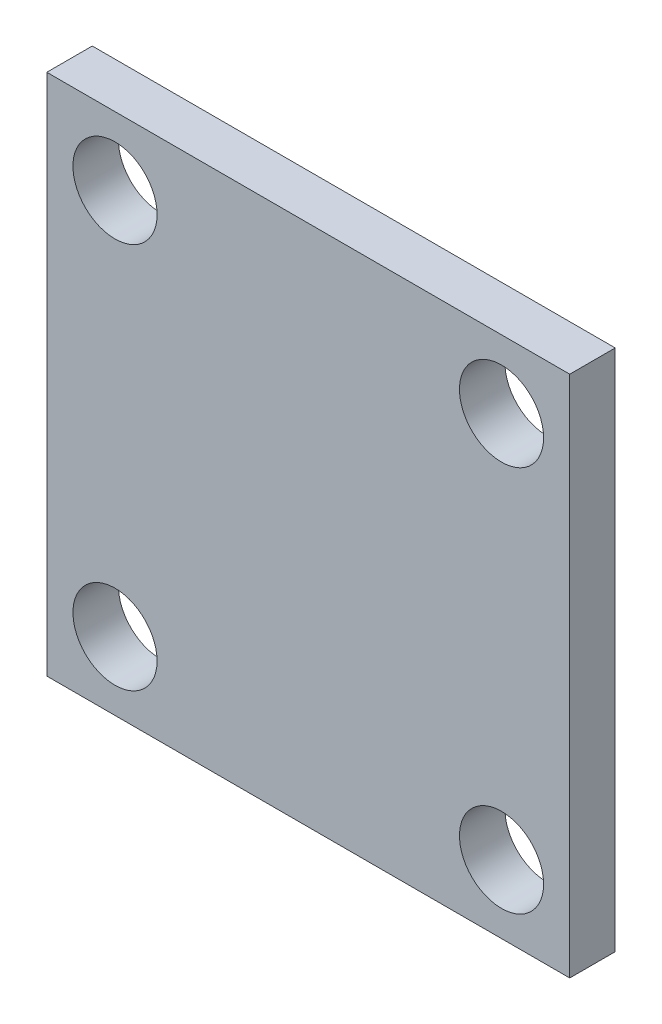
ISO-10303-21;
HEADER;
FILE_DESCRIPTION(('STEP AP214'),'2;1');
FILE_NAME('part.step','',(''),(''),'','','');
FILE_SCHEMA(('AUTOMOTIVE_DESIGN { 1 0 10303 214 1 1 1 1 }'));
ENDSEC;
DATA;
#1=APPLICATION_CONTEXT('core data for automotive mechanical design processes');
#2=APPLICATION_PROTOCOL_DEFINITION('international standard','automotive_design',2000,#1);
#3=PRODUCT_CONTEXT('',#1,'mechanical');
#4=PRODUCT('Part','Part','',(#3));
#5=PRODUCT_RELATED_PRODUCT_CATEGORY('part','',(#4));
#6=PRODUCT_DEFINITION_FORMATION('','',#4);
#7=PRODUCT_DEFINITION_CONTEXT('part definition',#1,'design');
#8=PRODUCT_DEFINITION('design','',#6,#7);
#9=PRODUCT_DEFINITION_SHAPE('','',#8);
#10=(LENGTH_UNIT() NAMED_UNIT(*) SI_UNIT(.MILLI.,.METRE.));
#11=(NAMED_UNIT(*) PLANE_ANGLE_UNIT() SI_UNIT($,.RADIAN.));
#12=(NAMED_UNIT(*) SI_UNIT($,.STERADIAN.) SOLID_ANGLE_UNIT());
#13=UNCERTAINTY_MEASURE_WITH_UNIT(LENGTH_MEASURE(1.E-05),#10,'distance_accuracy_value','');
#14=(GEOMETRIC_REPRESENTATION_CONTEXT(3) GLOBAL_UNCERTAINTY_ASSIGNED_CONTEXT((#13)) GLOBAL_UNIT_ASSIGNED_CONTEXT((#10,
#11,#12)) REPRESENTATION_CONTEXT('',''));
#15=CARTESIAN_POINT('',(0.,0.,0.));
#16=DIRECTION('',(0.,0.,1.));
#17=DIRECTION('',(1.,0.,0.));
#18=AXIS2_PLACEMENT_3D('',#15,#16,#17);
#19=CARTESIAN_POINT('',(0.,0.,2.));
#20=DIRECTION('',(0.,0.,-1.));
#21=DIRECTION('',(-1.,0.,0.));
#22=AXIS2_PLACEMENT_3D('',#19,#20,#21);
#23=PLANE('',#22);
#24=DIRECTION('',(0.,1.,0.));
#25=VECTOR('',#24,1.);
#26=CARTESIAN_POINT('',(11.5,-11.5,2.));
#27=LINE('',#26,#25);
#28=CARTESIAN_POINT('',(11.5,-11.5,2.));
#29=VERTEX_POINT('',#28);
#30=CARTESIAN_POINT('',(11.5,11.5,2.));
#31=VERTEX_POINT('',#30);
#32=EDGE_CURVE('E96',#29,#31,#27,.T.);
#33=ORIENTED_EDGE('',*,*,#32,.T.);
#34=DIRECTION('',(-1.,0.,0.));
#35=VECTOR('',#34,1.);
#36=CARTESIAN_POINT('',(-11.5,11.5,2.));
#37=LINE('',#36,#35);
#38=CARTESIAN_POINT('',(-11.5,11.5,2.));
#39=VERTEX_POINT('',#38);
#40=EDGE_CURVE('E91',#31,#39,#37,.T.);
#41=ORIENTED_EDGE('',*,*,#40,.T.);
#42=DIRECTION('',(0.,-1.,0.));
#43=VECTOR('',#42,1.);
#44=CARTESIAN_POINT('',(-11.5,-11.5,2.));
#45=LINE('',#44,#43);
#46=CARTESIAN_POINT('',(-11.5,-11.5,2.));
#47=VERTEX_POINT('',#46);
#48=EDGE_CURVE('E94',#39,#47,#45,.T.);
#49=ORIENTED_EDGE('',*,*,#48,.T.);
#50=DIRECTION('',(1.,0.,0.));
#51=VECTOR('',#50,1.);
#52=CARTESIAN_POINT('',(-11.5,-11.5,2.));
#53=LINE('',#52,#51);
#54=EDGE_CURVE('E61',#47,#29,#53,.T.);
#55=ORIENTED_EDGE('',*,*,#54,.T.);
#56=EDGE_LOOP('',(#33,#41,#49,#55));
#57=FACE_BOUND('',#56,.T.);
#58=CARTESIAN_POINT('',(-8.5,8.5,2.));
#59=DIRECTION('',(0.,0.,1.));
#60=DIRECTION('',(1.,0.,0.));
#61=AXIS2_PLACEMENT_3D('',#58,#59,#60);
#62=CIRCLE('',#61,1.85);
#63=CARTESIAN_POINT('',(-6.65,8.5,2.));
#64=VERTEX_POINT('',#63);
#65=EDGE_CURVE('E116',#64,#64,#62,.T.);
#66=ORIENTED_EDGE('',*,*,#65,.F.);
#67=EDGE_LOOP('',(#66));
#68=FACE_BOUND('',#67,.T.);
#69=CARTESIAN_POINT('',(8.5,8.5,2.));
#70=DIRECTION('',(0.,0.,1.));
#71=DIRECTION('',(1.,0.,0.));
#72=AXIS2_PLACEMENT_3D('',#69,#70,#71);
#73=CIRCLE('',#72,1.85);
#74=CARTESIAN_POINT('',(10.35,8.5,2.));
#75=VERTEX_POINT('',#74);
#76=EDGE_CURVE('E138',#75,#75,#73,.T.);
#77=ORIENTED_EDGE('',*,*,#76,.F.);
#78=EDGE_LOOP('',(#77));
#79=FACE_BOUND('',#78,.T.);
#80=CARTESIAN_POINT('',(8.5,-8.5,2.));
#81=DIRECTION('',(0.,0.,1.));
#82=DIRECTION('',(1.,0.,0.));
#83=AXIS2_PLACEMENT_3D('',#80,#81,#82);
#84=CIRCLE('',#83,1.85);
#85=CARTESIAN_POINT('',(10.35,-8.5,2.));
#86=VERTEX_POINT('',#85);
#87=EDGE_CURVE('E146',#86,#86,#84,.T.);
#88=ORIENTED_EDGE('',*,*,#87,.F.);
#89=EDGE_LOOP('',(#88));
#90=FACE_BOUND('',#89,.T.);
#91=CARTESIAN_POINT('',(-8.5,-8.5,2.));
#92=DIRECTION('',(0.,0.,1.));
#93=DIRECTION('',(1.,0.,0.));
#94=AXIS2_PLACEMENT_3D('',#91,#92,#93);
#95=CIRCLE('',#94,1.85);
#96=CARTESIAN_POINT('',(-6.65,-8.5,2.));
#97=VERTEX_POINT('',#96);
#98=EDGE_CURVE('E154',#97,#97,#95,.T.);
#99=ORIENTED_EDGE('',*,*,#98,.F.);
#100=EDGE_LOOP('',(#99));
#101=FACE_BOUND('',#100,.T.);
#102=ADVANCED_FACE('F43',(#57,#68,#79,#90,#101),#23,.F.);
#103=CARTESIAN_POINT('',(0.,0.,0.));
#104=DIRECTION('',(0.,0.,-1.));
#105=DIRECTION('',(-1.,0.,0.));
#106=AXIS2_PLACEMENT_3D('',#103,#104,#105);
#107=PLANE('',#106);
#108=CARTESIAN_POINT('',(8.5,-8.5,0.));
#109=DIRECTION('',(0.,0.,1.));
#110=DIRECTION('',(1.,0.,0.));
#111=AXIS2_PLACEMENT_3D('',#108,#109,#110);
#112=CIRCLE('',#111,1.85);
#113=CARTESIAN_POINT('',(10.35,-8.5,0.));
#114=VERTEX_POINT('',#113);
#115=EDGE_CURVE('E150',#114,#114,#112,.T.);
#116=ORIENTED_EDGE('',*,*,#115,.T.);
#117=EDGE_LOOP('',(#116));
#118=FACE_BOUND('',#117,.T.);
#119=CARTESIAN_POINT('',(-8.5,8.5,0.));
#120=DIRECTION('',(0.,0.,1.));
#121=DIRECTION('',(1.,0.,0.));
#122=AXIS2_PLACEMENT_3D('',#119,#120,#121);
#123=CIRCLE('',#122,1.85);
#124=CARTESIAN_POINT('',(-6.65,8.5,0.));
#125=VERTEX_POINT('',#124);
#126=EDGE_CURVE('E134',#125,#125,#123,.T.);
#127=ORIENTED_EDGE('',*,*,#126,.T.);
#128=EDGE_LOOP('',(#127));
#129=FACE_BOUND('',#128,.T.);
#130=DIRECTION('',(0.,1.,0.));
#131=VECTOR('',#130,1.);
#132=CARTESIAN_POINT('',(11.5,-11.5,0.));
#133=LINE('',#132,#131);
#134=CARTESIAN_POINT('',(11.5,-11.5,0.));
#135=VERTEX_POINT('',#134);
#136=CARTESIAN_POINT('',(11.5,11.5,0.));
#137=VERTEX_POINT('',#136);
#138=EDGE_CURVE('E112',#135,#137,#133,.T.);
#139=ORIENTED_EDGE('',*,*,#138,.F.);
#140=DIRECTION('',(1.,0.,0.));
#141=VECTOR('',#140,1.);
#142=CARTESIAN_POINT('',(-11.5,-11.5,0.));
#143=LINE('',#142,#141);
#144=CARTESIAN_POINT('',(-11.5,-11.5,0.));
#145=VERTEX_POINT('',#144);
#146=EDGE_CURVE('E84',#145,#135,#143,.T.);
#147=ORIENTED_EDGE('',*,*,#146,.F.);
#148=DIRECTION('',(0.,-1.,0.));
#149=VECTOR('',#148,1.);
#150=CARTESIAN_POINT('',(-11.5,-11.5,0.));
#151=LINE('',#150,#149);
#152=CARTESIAN_POINT('',(-11.5,11.5,0.));
#153=VERTEX_POINT('',#152);
#154=EDGE_CURVE('E78',#153,#145,#151,.T.);
#155=ORIENTED_EDGE('',*,*,#154,.F.);
#156=DIRECTION('',(-1.,0.,0.));
#157=VECTOR('',#156,1.);
#158=CARTESIAN_POINT('',(-11.5,11.5,0.));
#159=LINE('',#158,#157);
#160=EDGE_CURVE('E101',#137,#153,#159,.T.);
#161=ORIENTED_EDGE('',*,*,#160,.F.);
#162=EDGE_LOOP('',(#139,#147,#155,#161));
#163=FACE_BOUND('',#162,.T.);
#164=CARTESIAN_POINT('',(8.5,8.5,0.));
#165=DIRECTION('',(0.,0.,1.));
#166=DIRECTION('',(1.,0.,0.));
#167=AXIS2_PLACEMENT_3D('',#164,#165,#166);
#168=CIRCLE('',#167,1.85);
#169=CARTESIAN_POINT('',(10.35,8.5,0.));
#170=VERTEX_POINT('',#169);
#171=EDGE_CURVE('E142',#170,#170,#168,.T.);
#172=ORIENTED_EDGE('',*,*,#171,.T.);
#173=EDGE_LOOP('',(#172));
#174=FACE_BOUND('',#173,.T.);
#175=CARTESIAN_POINT('',(-8.5,-8.5,0.));
#176=DIRECTION('',(0.,0.,1.));
#177=DIRECTION('',(1.,0.,0.));
#178=AXIS2_PLACEMENT_3D('',#175,#176,#177);
#179=CIRCLE('',#178,1.85);
#180=CARTESIAN_POINT('',(-6.65,-8.5,0.));
#181=VERTEX_POINT('',#180);
#182=EDGE_CURVE('E158',#181,#181,#179,.T.);
#183=ORIENTED_EDGE('',*,*,#182,.T.);
#184=EDGE_LOOP('',(#183));
#185=FACE_BOUND('',#184,.T.);
#186=ADVANCED_FACE('F129',(#118,#129,#163,#174,#185),#107,.T.);
#187=CARTESIAN_POINT('',(11.5,-11.5,2.));
#188=DIRECTION('',(-1.,0.,0.));
#189=DIRECTION('',(0.,0.,1.));
#190=AXIS2_PLACEMENT_3D('',#187,#188,#189);
#191=PLANE('',#190);
#192=ORIENTED_EDGE('',*,*,#138,.T.);
#193=DIRECTION('',(0.,0.,-1.));
#194=VECTOR('',#193,1.);
#195=CARTESIAN_POINT('',(11.5,11.5,2.));
#196=LINE('',#195,#194);
#197=EDGE_CURVE('E11',#31,#137,#196,.T.);
#198=ORIENTED_EDGE('',*,*,#197,.F.);
#199=ORIENTED_EDGE('',*,*,#32,.F.);
#200=DIRECTION('',(0.,0.,-1.));
#201=VECTOR('',#200,1.);
#202=CARTESIAN_POINT('',(11.5,-11.5,2.));
#203=LINE('',#202,#201);
#204=EDGE_CURVE('E108',#29,#135,#203,.T.);
#205=ORIENTED_EDGE('',*,*,#204,.T.);
#206=EDGE_LOOP('',(#192,#198,#199,#205));
#207=FACE_BOUND('',#206,.T.);
#208=ADVANCED_FACE('F45',(#207),#191,.F.);
#209=CARTESIAN_POINT('',(-11.5,11.5,2.));
#210=DIRECTION('',(0.,-1.,0.));
#211=DIRECTION('',(0.,0.,-1.));
#212=AXIS2_PLACEMENT_3D('',#209,#210,#211);
#213=PLANE('',#212);
#214=ORIENTED_EDGE('',*,*,#160,.T.);
#215=DIRECTION('',(0.,0.,-1.));
#216=VECTOR('',#215,1.);
#217=CARTESIAN_POINT('',(-11.5,11.5,2.));
#218=LINE('',#217,#216);
#219=EDGE_CURVE('E53',#39,#153,#218,.T.);
#220=ORIENTED_EDGE('',*,*,#219,.F.);
#221=ORIENTED_EDGE('',*,*,#40,.F.);
#222=ORIENTED_EDGE('',*,*,#197,.T.);
#223=EDGE_LOOP('',(#214,#220,#221,#222));
#224=FACE_BOUND('',#223,.T.);
#225=ADVANCED_FACE('F100',(#224),#213,.F.);
#226=CARTESIAN_POINT('',(-11.5,-11.5,2.));
#227=DIRECTION('',(1.,0.,0.));
#228=DIRECTION('',(0.,0.,-1.));
#229=AXIS2_PLACEMENT_3D('',#226,#227,#228);
#230=PLANE('',#229);
#231=ORIENTED_EDGE('',*,*,#154,.T.);
#232=DIRECTION('',(0.,0.,-1.));
#233=VECTOR('',#232,1.);
#234=CARTESIAN_POINT('',(-11.5,-11.5,2.));
#235=LINE('',#234,#233);
#236=EDGE_CURVE('E103',#47,#145,#235,.T.);
#237=ORIENTED_EDGE('',*,*,#236,.F.);
#238=ORIENTED_EDGE('',*,*,#48,.F.);
#239=ORIENTED_EDGE('',*,*,#219,.T.);
#240=EDGE_LOOP('',(#231,#237,#238,#239));
#241=FACE_BOUND('',#240,.T.);
#242=ADVANCED_FACE('F104',(#241),#230,.F.);
#243=CARTESIAN_POINT('',(-11.5,-11.5,2.));
#244=DIRECTION('',(0.,1.,0.));
#245=DIRECTION('',(0.,0.,1.));
#246=AXIS2_PLACEMENT_3D('',#243,#244,#245);
#247=PLANE('',#246);
#248=ORIENTED_EDGE('',*,*,#146,.T.);
#249=ORIENTED_EDGE('',*,*,#204,.F.);
#250=ORIENTED_EDGE('',*,*,#54,.F.);
#251=ORIENTED_EDGE('',*,*,#236,.T.);
#252=EDGE_LOOP('',(#248,#249,#250,#251));
#253=FACE_BOUND('',#252,.T.);
#254=ADVANCED_FACE('F126',(#253),#247,.F.);
#255=CARTESIAN_POINT('',(-8.5,8.5,2.));
#256=DIRECTION('',(0.,0.,-1.));
#257=DIRECTION('',(-1.,0.,0.));
#258=AXIS2_PLACEMENT_3D('',#255,#256,#257);
#259=CYLINDRICAL_SURFACE('',#258,1.85);
#260=ORIENTED_EDGE('',*,*,#65,.T.);
#261=EDGE_LOOP('',(#260));
#262=FACE_BOUND('',#261,.T.);
#263=ORIENTED_EDGE('',*,*,#126,.F.);
#264=EDGE_LOOP('',(#263));
#265=FACE_BOUND('',#264,.T.);
#266=ADVANCED_FACE('F177',(#262,#265),#259,.F.);
#267=CARTESIAN_POINT('',(8.5,8.5,2.));
#268=DIRECTION('',(0.,0.,-1.));
#269=DIRECTION('',(-1.,0.,0.));
#270=AXIS2_PLACEMENT_3D('',#267,#268,#269);
#271=CYLINDRICAL_SURFACE('',#270,1.85);
#272=ORIENTED_EDGE('',*,*,#76,.T.);
#273=EDGE_LOOP('',(#272));
#274=FACE_BOUND('',#273,.T.);
#275=ORIENTED_EDGE('',*,*,#171,.F.);
#276=EDGE_LOOP('',(#275));
#277=FACE_BOUND('',#276,.T.);
#278=ADVANCED_FACE('F231',(#274,#277),#271,.F.);
#279=CARTESIAN_POINT('',(8.5,-8.5,2.));
#280=DIRECTION('',(0.,0.,-1.));
#281=DIRECTION('',(-1.,0.,0.));
#282=AXIS2_PLACEMENT_3D('',#279,#280,#281);
#283=CYLINDRICAL_SURFACE('',#282,1.85);
#284=ORIENTED_EDGE('',*,*,#87,.T.);
#285=EDGE_LOOP('',(#284));
#286=FACE_BOUND('',#285,.T.);
#287=ORIENTED_EDGE('',*,*,#115,.F.);
#288=EDGE_LOOP('',(#287));
#289=FACE_BOUND('',#288,.T.);
#290=ADVANCED_FACE('F240',(#286,#289),#283,.F.);
#291=CARTESIAN_POINT('',(-8.5,-8.5,2.));
#292=DIRECTION('',(0.,0.,-1.));
#293=DIRECTION('',(-1.,0.,0.));
#294=AXIS2_PLACEMENT_3D('',#291,#292,#293);
#295=CYLINDRICAL_SURFACE('',#294,1.85);
#296=ORIENTED_EDGE('',*,*,#98,.T.);
#297=EDGE_LOOP('',(#296));
#298=FACE_BOUND('',#297,.T.);
#299=ORIENTED_EDGE('',*,*,#182,.F.);
#300=EDGE_LOOP('',(#299));
#301=FACE_BOUND('',#300,.T.);
#302=ADVANCED_FACE('F166',(#298,#301),#295,.F.);
#303=CLOSED_SHELL('',(#102,#186,#208,#225,#242,#254,#266,#278,#290,#302));
#304=MANIFOLD_SOLID_BREP('B2',#303);
#305=ADVANCED_BREP_SHAPE_REPRESENTATION('',(#18,#304),#14);
#306=SHAPE_DEFINITION_REPRESENTATION(#9,#305);
ENDSEC;
END-ISO-10303-21;
